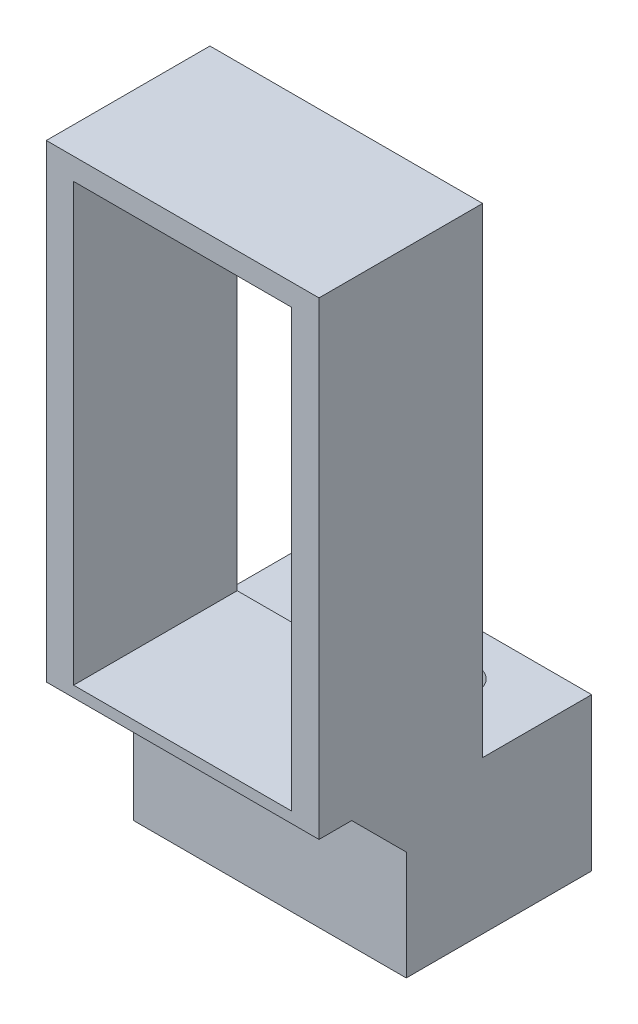
ISO-10303-21;
HEADER;
FILE_DESCRIPTION(('STEP AP214'),'2;1');
FILE_NAME('part.step','',(''),(''),'','','');
FILE_SCHEMA(('AUTOMOTIVE_DESIGN { 1 0 10303 214 1 1 1 1 }'));
ENDSEC;
DATA;
#1=APPLICATION_CONTEXT('core data for automotive mechanical design processes');
#2=APPLICATION_PROTOCOL_DEFINITION('international standard','automotive_design',2000,#1);
#3=PRODUCT_CONTEXT('',#1,'mechanical');
#4=PRODUCT('Part','Part','',(#3));
#5=PRODUCT_RELATED_PRODUCT_CATEGORY('part','',(#4));
#6=PRODUCT_DEFINITION_FORMATION('','',#4);
#7=PRODUCT_DEFINITION_CONTEXT('part definition',#1,'design');
#8=PRODUCT_DEFINITION('design','',#6,#7);
#9=PRODUCT_DEFINITION_SHAPE('','',#8);
#10=(LENGTH_UNIT() NAMED_UNIT(*) SI_UNIT(.MILLI.,.METRE.));
#11=(NAMED_UNIT(*) PLANE_ANGLE_UNIT() SI_UNIT($,.RADIAN.));
#12=(NAMED_UNIT(*) SI_UNIT($,.STERADIAN.) SOLID_ANGLE_UNIT());
#13=UNCERTAINTY_MEASURE_WITH_UNIT(LENGTH_MEASURE(1.E-05),#10,'distance_accuracy_value','');
#14=(GEOMETRIC_REPRESENTATION_CONTEXT(3) GLOBAL_UNCERTAINTY_ASSIGNED_CONTEXT((#13)) GLOBAL_UNIT_ASSIGNED_CONTEXT((#10,
#11,#12)) REPRESENTATION_CONTEXT('',''));
#15=CARTESIAN_POINT('',(0.,0.,0.));
#16=DIRECTION('',(0.,0.,1.));
#17=DIRECTION('',(1.,0.,0.));
#18=AXIS2_PLACEMENT_3D('',#15,#16,#17);
#19=CARTESIAN_POINT('',(0.,14.,0.));
#20=DIRECTION('',(0.,1.,0.));
#21=DIRECTION('',(0.,0.,1.));
#22=AXIS2_PLACEMENT_3D('',#19,#20,#21);
#23=PLANE('',#22);
#24=CARTESIAN_POINT('',(5.,14.,-7.5));
#25=DIRECTION('',(0.,1.,0.));
#26=DIRECTION('',(0.,0.,1.));
#27=AXIS2_PLACEMENT_3D('',#24,#25,#26);
#28=CIRCLE('',#27,2.);
#29=CARTESIAN_POINT('',(5.,14.,-5.5));
#30=VERTEX_POINT('',#29);
#31=EDGE_CURVE('E259',#30,#30,#28,.T.);
#32=ORIENTED_EDGE('',*,*,#31,.F.);
#33=EDGE_LOOP('',(#32));
#34=FACE_BOUND('',#33,.T.);
#35=CARTESIAN_POINT('',(-5.,14.,-7.5));
#36=DIRECTION('',(0.,1.,0.));
#37=DIRECTION('',(0.,0.,1.));
#38=AXIS2_PLACEMENT_3D('',#35,#36,#37);
#39=CIRCLE('',#38,2.);
#40=CARTESIAN_POINT('',(-5.,14.,-5.5));
#41=VERTEX_POINT('',#40);
#42=EDGE_CURVE('E260',#41,#41,#39,.T.);
#43=ORIENTED_EDGE('',*,*,#42,.F.);
#44=EDGE_LOOP('',(#43));
#45=FACE_BOUND('',#44,.T.);
#46=DIRECTION('',(0.,0.,1.));
#47=VECTOR('',#46,1.);
#48=CARTESIAN_POINT('',(-12.5,14.,0.));
#49=LINE('',#48,#47);
#50=CARTESIAN_POINT('',(-12.5,14.,-12.5));
#51=VERTEX_POINT('',#50);
#52=CARTESIAN_POINT('',(-12.5,14.,-2.5));
#53=VERTEX_POINT('',#52);
#54=EDGE_CURVE('E182',#51,#53,#49,.T.);
#55=ORIENTED_EDGE('',*,*,#54,.T.);
#56=DIRECTION('',(1.,0.,0.));
#57=VECTOR('',#56,1.);
#58=CARTESIAN_POINT('',(-12.5,14.,-2.5));
#59=LINE('',#58,#57);
#60=CARTESIAN_POINT('',(12.5,14.,-2.5));
#61=VERTEX_POINT('',#60);
#62=EDGE_CURVE('E168',#53,#61,#59,.T.);
#63=ORIENTED_EDGE('',*,*,#62,.T.);
#64=DIRECTION('',(0.,0.,-1.));
#65=VECTOR('',#64,1.);
#66=CARTESIAN_POINT('',(12.5,14.,0.));
#67=LINE('',#66,#65);
#68=CARTESIAN_POINT('',(12.5,14.,-12.5));
#69=VERTEX_POINT('',#68);
#70=EDGE_CURVE('E177',#61,#69,#67,.T.);
#71=ORIENTED_EDGE('',*,*,#70,.T.);
#72=DIRECTION('',(-1.,0.,0.));
#73=VECTOR('',#72,1.);
#74=CARTESIAN_POINT('',(0.,14.,-12.5));
#75=LINE('',#74,#73);
#76=EDGE_CURVE('E179',#69,#51,#75,.T.);
#77=ORIENTED_EDGE('',*,*,#76,.T.);
#78=EDGE_LOOP('',(#55,#63,#71,#77));
#79=FACE_BOUND('',#78,.T.);
#80=ADVANCED_FACE('F37',(#34,#45,#79),#23,.T.);
#81=CARTESIAN_POINT('',(0.,14.,12.5));
#82=DIRECTION('',(0.,0.,-1.));
#83=DIRECTION('',(-1.,0.,0.));
#84=AXIS2_PLACEMENT_3D('',#81,#82,#83);
#85=PLANE('',#84);
#86=DIRECTION('',(0.,-1.,0.));
#87=VECTOR('',#86,1.);
#88=CARTESIAN_POINT('',(-12.5,14.,12.5));
#89=LINE('',#88,#87);
#90=CARTESIAN_POINT('',(-12.5,58.,12.5));
#91=VERTEX_POINT('',#90);
#92=CARTESIAN_POINT('',(-12.5,15.,12.5));
#93=VERTEX_POINT('',#92);
#94=EDGE_CURVE('E149',#91,#93,#89,.T.);
#95=ORIENTED_EDGE('',*,*,#94,.T.);
#96=DIRECTION('',(-1.,0.,0.));
#97=VECTOR('',#96,1.);
#98=CARTESIAN_POINT('',(12.501,15.,12.5));
#99=LINE('',#98,#97);
#100=CARTESIAN_POINT('',(12.5,15.,12.5));
#101=VERTEX_POINT('',#100);
#102=EDGE_CURVE('E135',#101,#93,#99,.T.);
#103=ORIENTED_EDGE('',*,*,#102,.F.);
#104=DIRECTION('',(0.,-1.,0.));
#105=VECTOR('',#104,1.);
#106=CARTESIAN_POINT('',(12.5,14.,12.5));
#107=LINE('',#106,#105);
#108=CARTESIAN_POINT('',(12.5,58.,12.5));
#109=VERTEX_POINT('',#108);
#110=EDGE_CURVE('E11',#109,#101,#107,.T.);
#111=ORIENTED_EDGE('',*,*,#110,.F.);
#112=DIRECTION('',(-1.,0.,0.));
#113=VECTOR('',#112,1.);
#114=CARTESIAN_POINT('',(12.5,58.,12.5));
#115=LINE('',#114,#113);
#116=EDGE_CURVE('E162',#109,#91,#115,.T.);
#117=ORIENTED_EDGE('',*,*,#116,.T.);
#118=EDGE_LOOP('',(#95,#103,#111,#117));
#119=FACE_BOUND('',#118,.T.);
#120=DIRECTION('',(-1.,0.,0.));
#121=VECTOR('',#120,1.);
#122=CARTESIAN_POINT('',(-10.,56.,12.5));
#123=LINE('',#122,#121);
#124=CARTESIAN_POINT('',(10.,56.,12.5));
#125=VERTEX_POINT('',#124);
#126=CARTESIAN_POINT('',(-10.,56.,12.5));
#127=VERTEX_POINT('',#126);
#128=EDGE_CURVE('E141',#125,#127,#123,.T.);
#129=ORIENTED_EDGE('',*,*,#128,.F.);
#130=DIRECTION('',(0.,1.,0.));
#131=VECTOR('',#130,1.);
#132=CARTESIAN_POINT('',(10.,56.,12.5));
#133=LINE('',#132,#131);
#134=CARTESIAN_POINT('',(10.,16.,12.5));
#135=VERTEX_POINT('',#134);
#136=EDGE_CURVE('E219',#135,#125,#133,.T.);
#137=ORIENTED_EDGE('',*,*,#136,.F.);
#138=DIRECTION('',(1.,0.,0.));
#139=VECTOR('',#138,1.);
#140=CARTESIAN_POINT('',(10.,16.,12.5));
#141=LINE('',#140,#139);
#142=CARTESIAN_POINT('',(-9.99999999999999,16.,12.5));
#143=VERTEX_POINT('',#142);
#144=EDGE_CURVE('E223',#143,#135,#141,.T.);
#145=ORIENTED_EDGE('',*,*,#144,.F.);
#146=DIRECTION('',(0.,-1.,0.));
#147=VECTOR('',#146,1.);
#148=CARTESIAN_POINT('',(-10.,56.,12.5));
#149=LINE('',#148,#147);
#150=EDGE_CURVE('E226',#127,#143,#149,.T.);
#151=ORIENTED_EDGE('',*,*,#150,.F.);
#152=EDGE_LOOP('',(#129,#137,#145,#151));
#153=FACE_BOUND('',#152,.T.);
#154=ADVANCED_FACE('F39',(#119,#153),#85,.F.);
#155=CARTESIAN_POINT('',(12.5,14.,0.));
#156=DIRECTION('',(-1.,0.,0.));
#157=DIRECTION('',(0.,0.,1.));
#158=AXIS2_PLACEMENT_3D('',#155,#156,#157);
#159=PLANE('',#158);
#160=DIRECTION('',(0.,0.707106781186547,0.707106781186548));
#161=VECTOR('',#160,1.);
#162=CARTESIAN_POINT('',(12.5,10.,4.5));
#163=LINE('',#162,#161);
#164=CARTESIAN_POINT('',(12.5,10.,4.5));
#165=VERTEX_POINT('',#164);
#166=CARTESIAN_POINT('',(12.5,15.,9.5));
#167=VERTEX_POINT('',#166);
#168=EDGE_CURVE('E253',#165,#167,#163,.T.);
#169=ORIENTED_EDGE('',*,*,#168,.F.);
#170=DIRECTION('',(0.,1.,0.));
#171=VECTOR('',#170,1.);
#172=CARTESIAN_POINT('',(12.5,10.,4.5));
#173=LINE('',#172,#171);
#174=CARTESIAN_POINT('',(12.5,0.,4.5));
#175=VERTEX_POINT('',#174);
#176=EDGE_CURVE('E250',#175,#165,#173,.T.);
#177=ORIENTED_EDGE('',*,*,#176,.F.);
#178=DIRECTION('',(0.,0.,-1.));
#179=VECTOR('',#178,1.);
#180=CARTESIAN_POINT('',(12.5,0.,0.));
#181=LINE('',#180,#179);
#182=CARTESIAN_POINT('',(12.5,0.,-12.5));
#183=VERTEX_POINT('',#182);
#184=EDGE_CURVE('E175',#175,#183,#181,.T.);
#185=ORIENTED_EDGE('',*,*,#184,.T.);
#186=DIRECTION('',(0.,-1.,0.));
#187=VECTOR('',#186,1.);
#188=CARTESIAN_POINT('',(12.5,14.,-12.5));
#189=LINE('',#188,#187);
#190=EDGE_CURVE('E45',#69,#183,#189,.T.);
#191=ORIENTED_EDGE('',*,*,#190,.F.);
#192=ORIENTED_EDGE('',*,*,#70,.F.);
#193=DIRECTION('',(0.,1.,0.));
#194=VECTOR('',#193,1.);
#195=CARTESIAN_POINT('',(12.5,14.,-2.5));
#196=LINE('',#195,#194);
#197=CARTESIAN_POINT('',(12.5,58.,-2.5));
#198=VERTEX_POINT('',#197);
#199=EDGE_CURVE('E60',#61,#198,#196,.T.);
#200=ORIENTED_EDGE('',*,*,#199,.T.);
#201=DIRECTION('',(0.,0.,1.));
#202=VECTOR('',#201,1.);
#203=CARTESIAN_POINT('',(12.5,58.,-2.5));
#204=LINE('',#203,#202);
#205=EDGE_CURVE('E153',#198,#109,#204,.T.);
#206=ORIENTED_EDGE('',*,*,#205,.T.);
#207=ORIENTED_EDGE('',*,*,#110,.T.);
#208=DIRECTION('',(0.,0.,1.));
#209=VECTOR('',#208,1.);
#210=CARTESIAN_POINT('',(12.5,15.,12.5));
#211=LINE('',#210,#209);
#212=EDGE_CURVE('E131',#167,#101,#211,.T.);
#213=ORIENTED_EDGE('',*,*,#212,.F.);
#214=EDGE_LOOP('',(#169,#177,#185,#191,#192,#200,#206,#207,#213));
#215=FACE_BOUND('',#214,.T.);
#216=ADVANCED_FACE('F151',(#215),#159,.F.);
#217=CARTESIAN_POINT('',(0.,14.,-12.5));
#218=DIRECTION('',(0.,0.,1.));
#219=DIRECTION('',(1.,0.,0.));
#220=AXIS2_PLACEMENT_3D('',#217,#218,#219);
#221=PLANE('',#220);
#222=DIRECTION('',(-1.,0.,0.));
#223=VECTOR('',#222,1.);
#224=CARTESIAN_POINT('',(0.,0.,-12.5));
#225=LINE('',#224,#223);
#226=CARTESIAN_POINT('',(-12.5,0.,-12.5));
#227=VERTEX_POINT('',#226);
#228=EDGE_CURVE('E186',#183,#227,#225,.T.);
#229=ORIENTED_EDGE('',*,*,#228,.T.);
#230=DIRECTION('',(0.,-1.,0.));
#231=VECTOR('',#230,1.);
#232=CARTESIAN_POINT('',(-12.5,14.,-12.5));
#233=LINE('',#232,#231);
#234=EDGE_CURVE('E191',#51,#227,#233,.T.);
#235=ORIENTED_EDGE('',*,*,#234,.F.);
#236=ORIENTED_EDGE('',*,*,#76,.F.);
#237=ORIENTED_EDGE('',*,*,#190,.T.);
#238=EDGE_LOOP('',(#229,#235,#236,#237));
#239=FACE_BOUND('',#238,.T.);
#240=ADVANCED_FACE('F198',(#239),#221,.F.);
#241=CARTESIAN_POINT('',(-12.5,14.,0.));
#242=DIRECTION('',(1.,0.,0.));
#243=DIRECTION('',(0.,0.,-1.));
#244=AXIS2_PLACEMENT_3D('',#241,#242,#243);
#245=PLANE('',#244);
#246=DIRECTION('',(0.,0.,1.));
#247=VECTOR('',#246,1.);
#248=CARTESIAN_POINT('',(-12.5,0.,0.));
#249=LINE('',#248,#247);
#250=CARTESIAN_POINT('',(-12.5,0.,4.5));
#251=VERTEX_POINT('',#250);
#252=EDGE_CURVE('E180',#227,#251,#249,.T.);
#253=ORIENTED_EDGE('',*,*,#252,.T.);
#254=DIRECTION('',(0.,-1.,0.));
#255=VECTOR('',#254,1.);
#256=CARTESIAN_POINT('',(-12.5,10.,4.5));
#257=LINE('',#256,#255);
#258=CARTESIAN_POINT('',(-12.5,10.,4.5));
#259=VERTEX_POINT('',#258);
#260=EDGE_CURVE('E52',#259,#251,#257,.T.);
#261=ORIENTED_EDGE('',*,*,#260,.F.);
#262=DIRECTION('',(0.,-0.707106781186547,-0.707106781186548));
#263=VECTOR('',#262,1.);
#264=CARTESIAN_POINT('',(-12.5,10.,4.5));
#265=LINE('',#264,#263);
#266=CARTESIAN_POINT('',(-12.5,15.,9.5));
#267=VERTEX_POINT('',#266);
#268=EDGE_CURVE('E245',#267,#259,#265,.T.);
#269=ORIENTED_EDGE('',*,*,#268,.F.);
#270=DIRECTION('',(0.,0.,-1.));
#271=VECTOR('',#270,1.);
#272=CARTESIAN_POINT('',(-12.5,15.,12.5));
#273=LINE('',#272,#271);
#274=EDGE_CURVE('E248',#93,#267,#273,.T.);
#275=ORIENTED_EDGE('',*,*,#274,.F.);
#276=ORIENTED_EDGE('',*,*,#94,.F.);
#277=DIRECTION('',(0.,0.,1.));
#278=VECTOR('',#277,1.);
#279=CARTESIAN_POINT('',(-12.5,58.,-2.5));
#280=LINE('',#279,#278);
#281=CARTESIAN_POINT('',(-12.5,58.,-2.5));
#282=VERTEX_POINT('',#281);
#283=EDGE_CURVE('E158',#282,#91,#280,.T.);
#284=ORIENTED_EDGE('',*,*,#283,.F.);
#285=DIRECTION('',(0.,-1.,0.));
#286=VECTOR('',#285,1.);
#287=CARTESIAN_POINT('',(-12.5,58.,-2.5));
#288=LINE('',#287,#286);
#289=EDGE_CURVE('E164',#282,#53,#288,.T.);
#290=ORIENTED_EDGE('',*,*,#289,.T.);
#291=ORIENTED_EDGE('',*,*,#54,.F.);
#292=ORIENTED_EDGE('',*,*,#234,.T.);
#293=EDGE_LOOP('',(#253,#261,#269,#275,#276,#284,#290,#291,#292));
#294=FACE_BOUND('',#293,.T.);
#295=ADVANCED_FACE('F205',(#294),#245,.F.);
#296=CARTESIAN_POINT('',(0.,0.,0.));
#297=DIRECTION('',(0.,1.,0.));
#298=DIRECTION('',(0.,0.,1.));
#299=AXIS2_PLACEMENT_3D('',#296,#297,#298);
#300=PLANE('',#299);
#301=CARTESIAN_POINT('',(5.,0.,-7.5));
#302=DIRECTION('',(0.,1.,0.));
#303=DIRECTION('',(0.,0.,1.));
#304=AXIS2_PLACEMENT_3D('',#301,#302,#303);
#305=CIRCLE('',#304,2.);
#306=CARTESIAN_POINT('',(5.,0.,-5.5));
#307=VERTEX_POINT('',#306);
#308=EDGE_CURVE('E255',#307,#307,#305,.F.);
#309=ORIENTED_EDGE('',*,*,#308,.F.);
#310=EDGE_LOOP('',(#309));
#311=FACE_BOUND('',#310,.T.);
#312=CARTESIAN_POINT('',(-5.,0.,-7.5));
#313=DIRECTION('',(0.,1.,0.));
#314=DIRECTION('',(0.,0.,1.));
#315=AXIS2_PLACEMENT_3D('',#312,#313,#314);
#316=CIRCLE('',#315,2.);
#317=CARTESIAN_POINT('',(-5.,0.,-5.5));
#318=VERTEX_POINT('',#317);
#319=EDGE_CURVE('E256',#318,#318,#316,.F.);
#320=ORIENTED_EDGE('',*,*,#319,.F.);
#321=EDGE_LOOP('',(#320));
#322=FACE_BOUND('',#321,.T.);
#323=ORIENTED_EDGE('',*,*,#184,.F.);
#324=DIRECTION('',(-1.,0.,0.));
#325=VECTOR('',#324,1.);
#326=CARTESIAN_POINT('',(12.501,0.,4.5));
#327=LINE('',#326,#325);
#328=EDGE_CURVE('E142',#175,#251,#327,.T.);
#329=ORIENTED_EDGE('',*,*,#328,.T.);
#330=ORIENTED_EDGE('',*,*,#252,.F.);
#331=ORIENTED_EDGE('',*,*,#228,.F.);
#332=EDGE_LOOP('',(#323,#329,#330,#331));
#333=FACE_BOUND('',#332,.T.);
#334=ADVANCED_FACE('F203',(#311,#322,#333),#300,.F.);
#335=CARTESIAN_POINT('',(12.5,58.,-2.5));
#336=DIRECTION('',(0.,1.,0.));
#337=DIRECTION('',(0.,0.,1.));
#338=AXIS2_PLACEMENT_3D('',#335,#336,#337);
#339=PLANE('',#338);
#340=ORIENTED_EDGE('',*,*,#116,.F.);
#341=ORIENTED_EDGE('',*,*,#205,.F.);
#342=DIRECTION('',(-1.,0.,0.));
#343=VECTOR('',#342,1.);
#344=CARTESIAN_POINT('',(12.5,58.,-2.5));
#345=LINE('',#344,#343);
#346=EDGE_CURVE('E159',#198,#282,#345,.T.);
#347=ORIENTED_EDGE('',*,*,#346,.T.);
#348=ORIENTED_EDGE('',*,*,#283,.T.);
#349=EDGE_LOOP('',(#340,#341,#347,#348));
#350=FACE_BOUND('',#349,.T.);
#351=ADVANCED_FACE('F163',(#350),#339,.T.);
#352=CARTESIAN_POINT('',(0.,0.,-2.5));
#353=DIRECTION('',(0.,0.,1.));
#354=DIRECTION('',(1.,0.,0.));
#355=AXIS2_PLACEMENT_3D('',#352,#353,#354);
#356=PLANE('',#355);
#357=DIRECTION('',(0.,1.,0.));
#358=VECTOR('',#357,1.);
#359=CARTESIAN_POINT('',(10.,56.,-2.5));
#360=LINE('',#359,#358);
#361=CARTESIAN_POINT('',(10.,16.,-2.5));
#362=VERTEX_POINT('',#361);
#363=CARTESIAN_POINT('',(10.,56.,-2.5));
#364=VERTEX_POINT('',#363);
#365=EDGE_CURVE('E216',#362,#364,#360,.T.);
#366=ORIENTED_EDGE('',*,*,#365,.T.);
#367=DIRECTION('',(-1.,0.,0.));
#368=VECTOR('',#367,1.);
#369=CARTESIAN_POINT('',(-10.,56.,-2.5));
#370=LINE('',#369,#368);
#371=CARTESIAN_POINT('',(-10.,56.,-2.5));
#372=VERTEX_POINT('',#371);
#373=EDGE_CURVE('E222',#364,#372,#370,.T.);
#374=ORIENTED_EDGE('',*,*,#373,.T.);
#375=DIRECTION('',(0.,-1.,0.));
#376=VECTOR('',#375,1.);
#377=CARTESIAN_POINT('',(-10.,56.,-2.5));
#378=LINE('',#377,#376);
#379=CARTESIAN_POINT('',(-9.99999999999999,16.,-2.5));
#380=VERTEX_POINT('',#379);
#381=EDGE_CURVE('E235',#372,#380,#378,.T.);
#382=ORIENTED_EDGE('',*,*,#381,.T.);
#383=DIRECTION('',(1.,0.,0.));
#384=VECTOR('',#383,1.);
#385=CARTESIAN_POINT('',(10.,16.,-2.5));
#386=LINE('',#385,#384);
#387=EDGE_CURVE('E232',#380,#362,#386,.T.);
#388=ORIENTED_EDGE('',*,*,#387,.T.);
#389=EDGE_LOOP('',(#366,#374,#382,#388));
#390=FACE_BOUND('',#389,.T.);
#391=ORIENTED_EDGE('',*,*,#289,.F.);
#392=ORIENTED_EDGE('',*,*,#346,.F.);
#393=ORIENTED_EDGE('',*,*,#199,.F.);
#394=ORIENTED_EDGE('',*,*,#62,.F.);
#395=EDGE_LOOP('',(#391,#392,#393,#394));
#396=FACE_BOUND('',#395,.T.);
#397=ADVANCED_FACE('F289',(#390,#396),#356,.F.);
#398=CARTESIAN_POINT('',(-10.,56.,-2.5));
#399=DIRECTION('',(0.,1.,0.));
#400=DIRECTION('',(-1.,0.,0.));
#401=AXIS2_PLACEMENT_3D('',#398,#399,#400);
#402=PLANE('',#401);
#403=ORIENTED_EDGE('',*,*,#128,.T.);
#404=DIRECTION('',(0.,0.,1.));
#405=VECTOR('',#404,1.);
#406=CARTESIAN_POINT('',(-10.,56.,-2.5));
#407=LINE('',#406,#405);
#408=EDGE_CURVE('E212',#372,#127,#407,.T.);
#409=ORIENTED_EDGE('',*,*,#408,.F.);
#410=ORIENTED_EDGE('',*,*,#373,.F.);
#411=DIRECTION('',(0.,0.,1.));
#412=VECTOR('',#411,1.);
#413=CARTESIAN_POINT('',(10.,56.,-2.5));
#414=LINE('',#413,#412);
#415=EDGE_CURVE('E165',#364,#125,#414,.T.);
#416=ORIENTED_EDGE('',*,*,#415,.T.);
#417=EDGE_LOOP('',(#403,#409,#410,#416));
#418=FACE_BOUND('',#417,.T.);
#419=ADVANCED_FACE('F348',(#418),#402,.F.);
#420=CARTESIAN_POINT('',(10.,56.,-2.5));
#421=DIRECTION('',(1.,0.,0.));
#422=DIRECTION('',(0.,1.,0.));
#423=AXIS2_PLACEMENT_3D('',#420,#421,#422);
#424=PLANE('',#423);
#425=ORIENTED_EDGE('',*,*,#136,.T.);
#426=ORIENTED_EDGE('',*,*,#415,.F.);
#427=ORIENTED_EDGE('',*,*,#365,.F.);
#428=DIRECTION('',(0.,0.,1.));
#429=VECTOR('',#428,1.);
#430=CARTESIAN_POINT('',(10.,16.,-2.5));
#431=LINE('',#430,#429);
#432=EDGE_CURVE('E170',#362,#135,#431,.T.);
#433=ORIENTED_EDGE('',*,*,#432,.T.);
#434=EDGE_LOOP('',(#425,#426,#427,#433));
#435=FACE_BOUND('',#434,.T.);
#436=ADVANCED_FACE('F344',(#435),#424,.F.);
#437=CARTESIAN_POINT('',(10.,16.,-2.5));
#438=DIRECTION('',(0.,-1.,0.));
#439=DIRECTION('',(1.,0.,0.));
#440=AXIS2_PLACEMENT_3D('',#437,#438,#439);
#441=PLANE('',#440);
#442=ORIENTED_EDGE('',*,*,#144,.T.);
#443=ORIENTED_EDGE('',*,*,#432,.F.);
#444=ORIENTED_EDGE('',*,*,#387,.F.);
#445=DIRECTION('',(0.,0.,1.));
#446=VECTOR('',#445,1.);
#447=CARTESIAN_POINT('',(-9.99999999999999,16.,-2.5));
#448=LINE('',#447,#446);
#449=EDGE_CURVE('E215',#380,#143,#448,.T.);
#450=ORIENTED_EDGE('',*,*,#449,.T.);
#451=EDGE_LOOP('',(#442,#443,#444,#450));
#452=FACE_BOUND('',#451,.T.);
#453=ADVANCED_FACE('F347',(#452),#441,.F.);
#454=CARTESIAN_POINT('',(-10.,56.,-2.5));
#455=DIRECTION('',(-1.,0.,0.));
#456=DIRECTION('',(0.,-1.,0.));
#457=AXIS2_PLACEMENT_3D('',#454,#455,#456);
#458=PLANE('',#457);
#459=ORIENTED_EDGE('',*,*,#150,.T.);
#460=ORIENTED_EDGE('',*,*,#449,.F.);
#461=ORIENTED_EDGE('',*,*,#381,.F.);
#462=ORIENTED_EDGE('',*,*,#408,.T.);
#463=EDGE_LOOP('',(#459,#460,#461,#462));
#464=FACE_BOUND('',#463,.T.);
#465=ADVANCED_FACE('F339',(#464),#458,.F.);
#466=CARTESIAN_POINT('',(12.501,10.,4.5));
#467=DIRECTION('',(0.,0.,-1.));
#468=DIRECTION('',(0.,1.,0.));
#469=AXIS2_PLACEMENT_3D('',#466,#467,#468);
#470=PLANE('',#469);
#471=ORIENTED_EDGE('',*,*,#176,.T.);
#472=DIRECTION('',(-1.,0.,0.));
#473=VECTOR('',#472,1.);
#474=CARTESIAN_POINT('',(12.501,10.,4.5));
#475=LINE('',#474,#473);
#476=EDGE_CURVE('E241',#165,#259,#475,.T.);
#477=ORIENTED_EDGE('',*,*,#476,.T.);
#478=ORIENTED_EDGE('',*,*,#260,.T.);
#479=ORIENTED_EDGE('',*,*,#328,.F.);
#480=EDGE_LOOP('',(#471,#477,#478,#479));
#481=FACE_BOUND('',#480,.T.);
#482=ADVANCED_FACE('F335',(#481),#470,.F.);
#483=CARTESIAN_POINT('',(12.501,10.,4.5));
#484=DIRECTION('',(0.,0.707106781186548,-0.707106781186547));
#485=DIRECTION('',(0.,0.707106781186547,0.707106781186548));
#486=AXIS2_PLACEMENT_3D('',#483,#484,#485);
#487=PLANE('',#486);
#488=ORIENTED_EDGE('',*,*,#168,.T.);
#489=DIRECTION('',(-1.,0.,0.));
#490=VECTOR('',#489,1.);
#491=CARTESIAN_POINT('',(12.501,15.,9.5));
#492=LINE('',#491,#490);
#493=EDGE_CURVE('E137',#167,#267,#492,.T.);
#494=ORIENTED_EDGE('',*,*,#493,.T.);
#495=ORIENTED_EDGE('',*,*,#268,.T.);
#496=ORIENTED_EDGE('',*,*,#476,.F.);
#497=EDGE_LOOP('',(#488,#494,#495,#496));
#498=FACE_BOUND('',#497,.T.);
#499=ADVANCED_FACE('F338',(#498),#487,.F.);
#500=CARTESIAN_POINT('',(12.501,15.,12.5));
#501=DIRECTION('',(0.,1.,0.));
#502=DIRECTION('',(0.,0.,1.));
#503=AXIS2_PLACEMENT_3D('',#500,#501,#502);
#504=PLANE('',#503);
#505=ORIENTED_EDGE('',*,*,#212,.T.);
#506=ORIENTED_EDGE('',*,*,#102,.T.);
#507=ORIENTED_EDGE('',*,*,#274,.T.);
#508=ORIENTED_EDGE('',*,*,#493,.F.);
#509=EDGE_LOOP('',(#505,#506,#507,#508));
#510=FACE_BOUND('',#509,.T.);
#511=ADVANCED_FACE('F133',(#510),#504,.F.);
#512=CARTESIAN_POINT('',(-5.,-0.001000000000001,-7.5));
#513=DIRECTION('',(0.,1.,0.));
#514=DIRECTION('',(0.,0.,1.));
#515=AXIS2_PLACEMENT_3D('',#512,#513,#514);
#516=CYLINDRICAL_SURFACE('',#515,2.);
#517=ORIENTED_EDGE('',*,*,#42,.T.);
#518=EDGE_LOOP('',(#517));
#519=FACE_BOUND('',#518,.T.);
#520=ORIENTED_EDGE('',*,*,#319,.T.);
#521=EDGE_LOOP('',(#520));
#522=FACE_BOUND('',#521,.T.);
#523=ADVANCED_FACE('F276',(#519,#522),#516,.F.);
#524=CARTESIAN_POINT('',(5.,-0.001000000000001,-7.5));
#525=DIRECTION('',(0.,1.,0.));
#526=DIRECTION('',(0.,0.,1.));
#527=AXIS2_PLACEMENT_3D('',#524,#525,#526);
#528=CYLINDRICAL_SURFACE('',#527,2.);
#529=ORIENTED_EDGE('',*,*,#31,.T.);
#530=EDGE_LOOP('',(#529));
#531=FACE_BOUND('',#530,.T.);
#532=ORIENTED_EDGE('',*,*,#308,.T.);
#533=EDGE_LOOP('',(#532));
#534=FACE_BOUND('',#533,.T.);
#535=ADVANCED_FACE('F268',(#531,#534),#528,.F.);
#536=CLOSED_SHELL('',(#80,#154,#216,#240,#295,#334,#351,#397,#419,#436,#453,#465,#482,#499,#511,
#523,#535));
#537=MANIFOLD_SOLID_BREP('B2',#536);
#538=ADVANCED_BREP_SHAPE_REPRESENTATION('',(#18,#537),#14);
#539=SHAPE_DEFINITION_REPRESENTATION(#9,#538);
ENDSEC;
END-ISO-10303-21;
